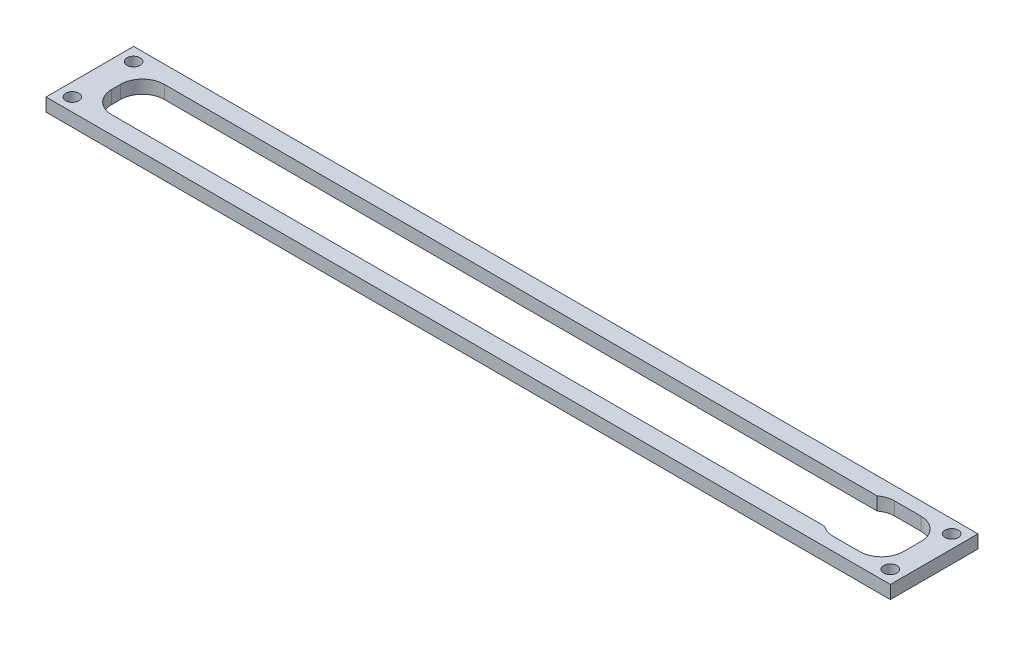
ISO-10303-21;
HEADER;
FILE_DESCRIPTION(('STEP AP214'),'2;1');
FILE_NAME('part.step','',(''),(''),'','','');
FILE_SCHEMA(('AUTOMOTIVE_DESIGN { 1 0 10303 214 1 1 1 1 }'));
ENDSEC;
DATA;
#1=APPLICATION_CONTEXT('core data for automotive mechanical design processes');
#2=APPLICATION_PROTOCOL_DEFINITION('international standard','automotive_design',2000,#1);
#3=PRODUCT_CONTEXT('',#1,'mechanical');
#4=PRODUCT('Part','Part','',(#3));
#5=PRODUCT_RELATED_PRODUCT_CATEGORY('part','',(#4));
#6=PRODUCT_DEFINITION_FORMATION('','',#4);
#7=PRODUCT_DEFINITION_CONTEXT('part definition',#1,'design');
#8=PRODUCT_DEFINITION('design','',#6,#7);
#9=PRODUCT_DEFINITION_SHAPE('','',#8);
#10=(LENGTH_UNIT() NAMED_UNIT(*) SI_UNIT(.MILLI.,.METRE.));
#11=(NAMED_UNIT(*) PLANE_ANGLE_UNIT() SI_UNIT($,.RADIAN.));
#12=(NAMED_UNIT(*) SI_UNIT($,.STERADIAN.) SOLID_ANGLE_UNIT());
#13=UNCERTAINTY_MEASURE_WITH_UNIT(LENGTH_MEASURE(1.E-05),#10,'distance_accuracy_value','');
#14=(GEOMETRIC_REPRESENTATION_CONTEXT(3) GLOBAL_UNCERTAINTY_ASSIGNED_CONTEXT((#13)) GLOBAL_UNIT_ASSIGNED_CONTEXT((#10,
#11,#12)) REPRESENTATION_CONTEXT('',''));
#15=CARTESIAN_POINT('',(0.,0.,0.));
#16=DIRECTION('',(0.,0.,1.));
#17=DIRECTION('',(1.,0.,0.));
#18=AXIS2_PLACEMENT_3D('',#15,#16,#17);
#19=CARTESIAN_POINT('',(0.,3.,0.));
#20=DIRECTION('',(0.,-1.,0.));
#21=DIRECTION('',(0.,0.,-1.));
#22=AXIS2_PLACEMENT_3D('',#19,#20,#21);
#23=PLANE('',#22);
#24=DIRECTION('',(0.,0.,1.));
#25=VECTOR('',#24,1.);
#26=CARTESIAN_POINT('',(0.,3.,0.));
#27=LINE('',#26,#25);
#28=CARTESIAN_POINT('',(0.,3.,-20.));
#29=VERTEX_POINT('',#28);
#30=CARTESIAN_POINT('',(0.,3.,0.));
#31=VERTEX_POINT('',#30);
#32=EDGE_CURVE('E250',#29,#31,#27,.T.);
#33=ORIENTED_EDGE('',*,*,#32,.T.);
#34=DIRECTION('',(1.,0.,0.));
#35=VECTOR('',#34,1.);
#36=CARTESIAN_POINT('',(0.,3.,0.));
#37=LINE('',#36,#35);
#38=CARTESIAN_POINT('',(192.641732707282,3.,0.));
#39=VERTEX_POINT('',#38);
#40=EDGE_CURVE('E253',#31,#39,#37,.T.);
#41=ORIENTED_EDGE('',*,*,#40,.T.);
#42=DIRECTION('',(0.,0.,-1.));
#43=VECTOR('',#42,1.);
#44=CARTESIAN_POINT('',(192.641732707282,3.,0.));
#45=LINE('',#44,#43);
#46=CARTESIAN_POINT('',(192.641732707282,3.,-20.));
#47=VERTEX_POINT('',#46);
#48=EDGE_CURVE('E256',#39,#47,#45,.T.);
#49=ORIENTED_EDGE('',*,*,#48,.T.);
#50=DIRECTION('',(-1.,0.,0.));
#51=VECTOR('',#50,1.);
#52=CARTESIAN_POINT('',(0.,3.,-20.));
#53=LINE('',#52,#51);
#54=EDGE_CURVE('E258',#47,#29,#53,.T.);
#55=ORIENTED_EDGE('',*,*,#54,.T.);
#56=EDGE_LOOP('',(#33,#41,#49,#55));
#57=FACE_BOUND('',#56,.T.);
#58=DIRECTION('',(-1.,0.,0.));
#59=VECTOR('',#58,1.);
#60=CARTESIAN_POINT('',(5.99999999999999,3.,-16.));
#61=LINE('',#60,#59);
#62=CARTESIAN_POINT('',(173.641732707282,3.,-16.));
#63=VERTEX_POINT('',#62);
#64=CARTESIAN_POINT('',(11.,3.,-16.));
#65=VERTEX_POINT('',#64);
#66=EDGE_CURVE('E243',#63,#65,#61,.T.);
#67=ORIENTED_EDGE('',*,*,#66,.F.);
#68=CARTESIAN_POINT('',(176.641732707282,3.,-12.));
#69=DIRECTION('',(0.,-1.,0.));
#70=DIRECTION('',(0.,0.,-1.));
#71=AXIS2_PLACEMENT_3D('',#68,#69,#70);
#72=CIRCLE('',#71,5.);
#73=CARTESIAN_POINT('',(176.641732707282,3.,-17.));
#74=VERTEX_POINT('',#73);
#75=EDGE_CURVE('E193',#63,#74,#72,.T.);
#76=ORIENTED_EDGE('',*,*,#75,.T.);
#77=DIRECTION('',(-1.,0.,0.));
#78=VECTOR('',#77,1.);
#79=CARTESIAN_POINT('',(173.641732707282,3.,-17.));
#80=LINE('',#79,#78);
#81=CARTESIAN_POINT('',(182.641732707282,3.,-17.));
#82=VERTEX_POINT('',#81);
#83=EDGE_CURVE('E205',#82,#74,#80,.T.);
#84=ORIENTED_EDGE('',*,*,#83,.F.);
#85=CARTESIAN_POINT('',(182.641732707282,3.,-12.));
#86=DIRECTION('',(0.,-1.,0.));
#87=DIRECTION('',(0.,0.,-1.));
#88=AXIS2_PLACEMENT_3D('',#85,#86,#87);
#89=CIRCLE('',#88,5.);
#90=CARTESIAN_POINT('',(187.641732707282,3.,-12.));
#91=VERTEX_POINT('',#90);
#92=EDGE_CURVE('E185',#82,#91,#89,.T.);
#93=ORIENTED_EDGE('',*,*,#92,.T.);
#94=DIRECTION('',(0.,0.,-1.));
#95=VECTOR('',#94,1.);
#96=CARTESIAN_POINT('',(187.641732707282,3.,-17.));
#97=LINE('',#96,#95);
#98=CARTESIAN_POINT('',(187.641732707282,3.,-8.00000000000001));
#99=VERTEX_POINT('',#98);
#100=EDGE_CURVE('E202',#99,#91,#97,.T.);
#101=ORIENTED_EDGE('',*,*,#100,.F.);
#102=CARTESIAN_POINT('',(182.641732707282,3.,-8.00000000000001));
#103=DIRECTION('',(0.,-1.,0.));
#104=DIRECTION('',(0.,0.,-1.));
#105=AXIS2_PLACEMENT_3D('',#102,#103,#104);
#106=CIRCLE('',#105,5.);
#107=CARTESIAN_POINT('',(182.641732707282,3.,-3.00000000000001));
#108=VERTEX_POINT('',#107);
#109=EDGE_CURVE('E189',#99,#108,#106,.T.);
#110=ORIENTED_EDGE('',*,*,#109,.T.);
#111=DIRECTION('',(1.,0.,0.));
#112=VECTOR('',#111,1.);
#113=CARTESIAN_POINT('',(173.641732707282,3.,-3.00000000000001));
#114=LINE('',#113,#112);
#115=CARTESIAN_POINT('',(176.641732707282,3.,-3.00000000000001));
#116=VERTEX_POINT('',#115);
#117=EDGE_CURVE('E200',#116,#108,#114,.T.);
#118=ORIENTED_EDGE('',*,*,#117,.F.);
#119=CARTESIAN_POINT('',(176.641732707282,3.,-8.00000000000001));
#120=DIRECTION('',(0.,-1.,0.));
#121=DIRECTION('',(0.,0.,-1.));
#122=AXIS2_PLACEMENT_3D('',#119,#120,#121);
#123=CIRCLE('',#122,5.);
#124=CARTESIAN_POINT('',(173.641732707282,3.,-4.00000000000002));
#125=VERTEX_POINT('',#124);
#126=EDGE_CURVE('E43',#116,#125,#123,.T.);
#127=ORIENTED_EDGE('',*,*,#126,.T.);
#128=DIRECTION('',(1.,0.,0.));
#129=VECTOR('',#128,1.);
#130=CARTESIAN_POINT('',(5.99999999999999,3.,-4.00000000000002));
#131=LINE('',#130,#129);
#132=CARTESIAN_POINT('',(11.,3.,-4.00000000000002));
#133=VERTEX_POINT('',#132);
#134=EDGE_CURVE('E162',#133,#125,#131,.T.);
#135=ORIENTED_EDGE('',*,*,#134,.F.);
#136=CARTESIAN_POINT('',(11.,3.,-9.00000000000001));
#137=DIRECTION('',(0.,-1.,0.));
#138=DIRECTION('',(0.,0.,-1.));
#139=AXIS2_PLACEMENT_3D('',#136,#137,#138);
#140=CIRCLE('',#139,5.);
#141=CARTESIAN_POINT('',(5.99999999999999,3.,-9.00000000000001));
#142=VERTEX_POINT('',#141);
#143=EDGE_CURVE('E179',#133,#142,#140,.T.);
#144=ORIENTED_EDGE('',*,*,#143,.T.);
#145=DIRECTION('',(0.,0.,1.));
#146=VECTOR('',#145,1.);
#147=CARTESIAN_POINT('',(5.99999999999999,3.,-16.));
#148=LINE('',#147,#146);
#149=CARTESIAN_POINT('',(5.99999999999999,3.,-11.));
#150=VERTEX_POINT('',#149);
#151=EDGE_CURVE('E239',#150,#142,#148,.T.);
#152=ORIENTED_EDGE('',*,*,#151,.F.);
#153=CARTESIAN_POINT('',(11.,3.,-11.));
#154=DIRECTION('',(0.,-1.,0.));
#155=DIRECTION('',(0.,0.,-1.));
#156=AXIS2_PLACEMENT_3D('',#153,#154,#155);
#157=CIRCLE('',#156,5.);
#158=EDGE_CURVE('E183',#150,#65,#157,.T.);
#159=ORIENTED_EDGE('',*,*,#158,.T.);
#160=EDGE_LOOP('',(#67,#76,#84,#93,#101,#110,#118,#127,#135,#144,#152,#159));
#161=FACE_BOUND('',#160,.T.);
#162=CARTESIAN_POINT('',(3.,3.,-17.));
#163=DIRECTION('',(0.,1.,0.));
#164=DIRECTION('',(0.,0.,1.));
#165=AXIS2_PLACEMENT_3D('',#162,#163,#164);
#166=CIRCLE('',#165,1.5);
#167=CARTESIAN_POINT('',(3.,3.,-15.5));
#168=VERTEX_POINT('',#167);
#169=EDGE_CURVE('E234',#168,#168,#166,.T.);
#170=ORIENTED_EDGE('',*,*,#169,.F.);
#171=EDGE_LOOP('',(#170));
#172=FACE_BOUND('',#171,.T.);
#173=CARTESIAN_POINT('',(3.,3.,-3.));
#174=DIRECTION('',(0.,1.,0.));
#175=DIRECTION('',(0.,0.,-1.));
#176=AXIS2_PLACEMENT_3D('',#173,#174,#175);
#177=CIRCLE('',#176,1.5);
#178=CARTESIAN_POINT('',(3.,3.,-4.5));
#179=VERTEX_POINT('',#178);
#180=EDGE_CURVE('E228',#179,#179,#177,.T.);
#181=ORIENTED_EDGE('',*,*,#180,.F.);
#182=EDGE_LOOP('',(#181));
#183=FACE_BOUND('',#182,.T.);
#184=CARTESIAN_POINT('',(189.641732707282,3.,-3.00000000000002));
#185=DIRECTION('',(0.,1.,0.));
#186=DIRECTION('',(0.,0.,1.));
#187=AXIS2_PLACEMENT_3D('',#184,#185,#186);
#188=CIRCLE('',#187,1.5);
#189=CARTESIAN_POINT('',(189.641732707282,3.,-1.50000000000002));
#190=VERTEX_POINT('',#189);
#191=EDGE_CURVE('E222',#190,#190,#188,.T.);
#192=ORIENTED_EDGE('',*,*,#191,.F.);
#193=EDGE_LOOP('',(#192));
#194=FACE_BOUND('',#193,.T.);
#195=CARTESIAN_POINT('',(189.641732707282,3.,-17.0000000000001));
#196=DIRECTION('',(0.,1.,0.));
#197=DIRECTION('',(0.,0.,-1.));
#198=AXIS2_PLACEMENT_3D('',#195,#196,#197);
#199=CIRCLE('',#198,1.5);
#200=CARTESIAN_POINT('',(189.641732707282,3.,-18.5000000000001));
#201=VERTEX_POINT('',#200);
#202=EDGE_CURVE('E216',#201,#201,#199,.T.);
#203=ORIENTED_EDGE('',*,*,#202,.F.);
#204=EDGE_LOOP('',(#203));
#205=FACE_BOUND('',#204,.T.);
#206=ADVANCED_FACE('F35',(#57,#161,#172,#183,#194,#205),#23,.F.);
#207=CARTESIAN_POINT('',(0.,0.,0.));
#208=DIRECTION('',(0.,-1.,0.));
#209=DIRECTION('',(0.,0.,-1.));
#210=AXIS2_PLACEMENT_3D('',#207,#208,#209);
#211=PLANE('',#210);
#212=DIRECTION('',(-1.,0.,0.));
#213=VECTOR('',#212,1.);
#214=CARTESIAN_POINT('',(173.641732707282,0.,-17.));
#215=LINE('',#214,#213);
#216=CARTESIAN_POINT('',(182.641732707282,0.,-17.));
#217=VERTEX_POINT('',#216);
#218=CARTESIAN_POINT('',(176.641732707282,0.,-17.));
#219=VERTEX_POINT('',#218);
#220=EDGE_CURVE('E165',#217,#219,#215,.T.);
#221=ORIENTED_EDGE('',*,*,#220,.T.);
#222=CARTESIAN_POINT('',(176.641732707282,0.,-12.));
#223=DIRECTION('',(0.,-1.,0.));
#224=DIRECTION('',(0.,0.,-1.));
#225=AXIS2_PLACEMENT_3D('',#222,#223,#224);
#226=CIRCLE('',#225,5.);
#227=CARTESIAN_POINT('',(173.641732707282,0.,-16.));
#228=VERTEX_POINT('',#227);
#229=EDGE_CURVE('E195',#219,#228,#226,.F.);
#230=ORIENTED_EDGE('',*,*,#229,.T.);
#231=DIRECTION('',(-1.,0.,0.));
#232=VECTOR('',#231,1.);
#233=CARTESIAN_POINT('',(5.99999999999999,0.,-16.));
#234=LINE('',#233,#232);
#235=CARTESIAN_POINT('',(11.,0.,-16.));
#236=VERTEX_POINT('',#235);
#237=EDGE_CURVE('E154',#228,#236,#234,.T.);
#238=ORIENTED_EDGE('',*,*,#237,.T.);
#239=CARTESIAN_POINT('',(11.,0.,-11.));
#240=DIRECTION('',(0.,-1.,0.));
#241=DIRECTION('',(0.,0.,-1.));
#242=AXIS2_PLACEMENT_3D('',#239,#240,#241);
#243=CIRCLE('',#242,5.);
#244=CARTESIAN_POINT('',(5.99999999999999,0.,-11.));
#245=VERTEX_POINT('',#244);
#246=EDGE_CURVE('E181',#236,#245,#243,.F.);
#247=ORIENTED_EDGE('',*,*,#246,.T.);
#248=DIRECTION('',(0.,0.,1.));
#249=VECTOR('',#248,1.);
#250=CARTESIAN_POINT('',(5.99999999999999,0.,-16.));
#251=LINE('',#250,#249);
#252=CARTESIAN_POINT('',(5.99999999999999,0.,-9.00000000000001));
#253=VERTEX_POINT('',#252);
#254=EDGE_CURVE('E155',#245,#253,#251,.T.);
#255=ORIENTED_EDGE('',*,*,#254,.T.);
#256=CARTESIAN_POINT('',(11.,0.,-9.00000000000001));
#257=DIRECTION('',(0.,-1.,0.));
#258=DIRECTION('',(0.,0.,-1.));
#259=AXIS2_PLACEMENT_3D('',#256,#257,#258);
#260=CIRCLE('',#259,5.);
#261=CARTESIAN_POINT('',(11.,0.,-4.00000000000002));
#262=VERTEX_POINT('',#261);
#263=EDGE_CURVE('E151',#253,#262,#260,.F.);
#264=ORIENTED_EDGE('',*,*,#263,.T.);
#265=DIRECTION('',(1.,0.,0.));
#266=VECTOR('',#265,1.);
#267=CARTESIAN_POINT('',(5.99999999999999,0.,-4.00000000000002));
#268=LINE('',#267,#266);
#269=CARTESIAN_POINT('',(173.641732707282,0.,-4.00000000000002));
#270=VERTEX_POINT('',#269);
#271=EDGE_CURVE('E145',#262,#270,#268,.T.);
#272=ORIENTED_EDGE('',*,*,#271,.T.);
#273=CARTESIAN_POINT('',(176.641732707282,0.,-8.00000000000001));
#274=DIRECTION('',(0.,-1.,0.));
#275=DIRECTION('',(0.,0.,-1.));
#276=AXIS2_PLACEMENT_3D('',#273,#274,#275);
#277=CIRCLE('',#276,5.);
#278=CARTESIAN_POINT('',(176.641732707282,0.,-3.00000000000001));
#279=VERTEX_POINT('',#278);
#280=EDGE_CURVE('E11',#270,#279,#277,.F.);
#281=ORIENTED_EDGE('',*,*,#280,.T.);
#282=DIRECTION('',(1.,0.,0.));
#283=VECTOR('',#282,1.);
#284=CARTESIAN_POINT('',(173.641732707282,0.,-3.00000000000001));
#285=LINE('',#284,#283);
#286=CARTESIAN_POINT('',(182.641732707282,0.,-3.00000000000001));
#287=VERTEX_POINT('',#286);
#288=EDGE_CURVE('E212',#279,#287,#285,.T.);
#289=ORIENTED_EDGE('',*,*,#288,.T.);
#290=CARTESIAN_POINT('',(182.641732707282,0.,-8.00000000000001));
#291=DIRECTION('',(0.,-1.,0.));
#292=DIRECTION('',(0.,0.,-1.));
#293=AXIS2_PLACEMENT_3D('',#290,#291,#292);
#294=CIRCLE('',#293,5.);
#295=CARTESIAN_POINT('',(187.641732707282,0.,-8.00000000000001));
#296=VERTEX_POINT('',#295);
#297=EDGE_CURVE('E191',#287,#296,#294,.F.);
#298=ORIENTED_EDGE('',*,*,#297,.T.);
#299=DIRECTION('',(0.,0.,-1.));
#300=VECTOR('',#299,1.);
#301=CARTESIAN_POINT('',(187.641732707282,0.,-17.));
#302=LINE('',#301,#300);
#303=CARTESIAN_POINT('',(187.641732707282,0.,-12.));
#304=VERTEX_POINT('',#303);
#305=EDGE_CURVE('E300',#296,#304,#302,.T.);
#306=ORIENTED_EDGE('',*,*,#305,.T.);
#307=CARTESIAN_POINT('',(182.641732707282,0.,-12.));
#308=DIRECTION('',(0.,-1.,0.));
#309=DIRECTION('',(0.,0.,-1.));
#310=AXIS2_PLACEMENT_3D('',#307,#308,#309);
#311=CIRCLE('',#310,5.);
#312=EDGE_CURVE('E187',#304,#217,#311,.F.);
#313=ORIENTED_EDGE('',*,*,#312,.T.);
#314=EDGE_LOOP('',(#221,#230,#238,#247,#255,#264,#272,#281,#289,#298,#306,#313));
#315=FACE_BOUND('',#314,.T.);
#316=CARTESIAN_POINT('',(189.641732707282,0.,-3.00000000000002));
#317=DIRECTION('',(0.,1.,0.));
#318=DIRECTION('',(0.,0.,1.));
#319=AXIS2_PLACEMENT_3D('',#316,#317,#318);
#320=CIRCLE('',#319,1.5);
#321=CARTESIAN_POINT('',(189.641732707282,0.,-1.50000000000002));
#322=VERTEX_POINT('',#321);
#323=EDGE_CURVE('E219',#322,#322,#320,.T.);
#324=ORIENTED_EDGE('',*,*,#323,.T.);
#325=EDGE_LOOP('',(#324));
#326=FACE_BOUND('',#325,.T.);
#327=CARTESIAN_POINT('',(3.,0.,-17.));
#328=DIRECTION('',(0.,1.,0.));
#329=DIRECTION('',(0.,0.,1.));
#330=AXIS2_PLACEMENT_3D('',#327,#328,#329);
#331=CIRCLE('',#330,1.5);
#332=CARTESIAN_POINT('',(3.,0.,-15.5));
#333=VERTEX_POINT('',#332);
#334=EDGE_CURVE('E231',#333,#333,#331,.T.);
#335=ORIENTED_EDGE('',*,*,#334,.T.);
#336=EDGE_LOOP('',(#335));
#337=FACE_BOUND('',#336,.T.);
#338=DIRECTION('',(0.,0.,1.));
#339=VECTOR('',#338,1.);
#340=CARTESIAN_POINT('',(0.,0.,0.));
#341=LINE('',#340,#339);
#342=CARTESIAN_POINT('',(0.,0.,-20.));
#343=VERTEX_POINT('',#342);
#344=CARTESIAN_POINT('',(0.,0.,0.));
#345=VERTEX_POINT('',#344);
#346=EDGE_CURVE('E246',#343,#345,#341,.T.);
#347=ORIENTED_EDGE('',*,*,#346,.F.);
#348=DIRECTION('',(-1.,0.,0.));
#349=VECTOR('',#348,1.);
#350=CARTESIAN_POINT('',(0.,0.,-20.));
#351=LINE('',#350,#349);
#352=CARTESIAN_POINT('',(192.641732707282,0.,-20.));
#353=VERTEX_POINT('',#352);
#354=EDGE_CURVE('E254',#353,#343,#351,.T.);
#355=ORIENTED_EDGE('',*,*,#354,.F.);
#356=DIRECTION('',(0.,0.,-1.));
#357=VECTOR('',#356,1.);
#358=CARTESIAN_POINT('',(192.641732707282,0.,0.));
#359=LINE('',#358,#357);
#360=CARTESIAN_POINT('',(192.641732707282,0.,0.));
#361=VERTEX_POINT('',#360);
#362=EDGE_CURVE('E265',#361,#353,#359,.T.);
#363=ORIENTED_EDGE('',*,*,#362,.F.);
#364=DIRECTION('',(1.,0.,0.));
#365=VECTOR('',#364,1.);
#366=CARTESIAN_POINT('',(0.,0.,0.));
#367=LINE('',#366,#365);
#368=EDGE_CURVE('E263',#345,#361,#367,.T.);
#369=ORIENTED_EDGE('',*,*,#368,.F.);
#370=EDGE_LOOP('',(#347,#355,#363,#369));
#371=FACE_BOUND('',#370,.T.);
#372=CARTESIAN_POINT('',(3.,0.,-3.));
#373=DIRECTION('',(0.,1.,0.));
#374=DIRECTION('',(0.,0.,-1.));
#375=AXIS2_PLACEMENT_3D('',#372,#373,#374);
#376=CIRCLE('',#375,1.5);
#377=CARTESIAN_POINT('',(3.,0.,-4.5));
#378=VERTEX_POINT('',#377);
#379=EDGE_CURVE('E225',#378,#378,#376,.T.);
#380=ORIENTED_EDGE('',*,*,#379,.T.);
#381=EDGE_LOOP('',(#380));
#382=FACE_BOUND('',#381,.T.);
#383=CARTESIAN_POINT('',(189.641732707282,0.,-17.0000000000001));
#384=DIRECTION('',(0.,1.,0.));
#385=DIRECTION('',(0.,0.,-1.));
#386=AXIS2_PLACEMENT_3D('',#383,#384,#385);
#387=CIRCLE('',#386,1.5);
#388=CARTESIAN_POINT('',(189.641732707282,0.,-18.5000000000001));
#389=VERTEX_POINT('',#388);
#390=EDGE_CURVE('E214',#389,#389,#387,.T.);
#391=ORIENTED_EDGE('',*,*,#390,.T.);
#392=EDGE_LOOP('',(#391));
#393=FACE_BOUND('',#392,.T.);
#394=ADVANCED_FACE('F148',(#315,#326,#337,#371,#382,#393),#211,.T.);
#395=CARTESIAN_POINT('',(0.,3.,0.));
#396=DIRECTION('',(1.,0.,0.));
#397=DIRECTION('',(0.,0.,-1.));
#398=AXIS2_PLACEMENT_3D('',#395,#396,#397);
#399=PLANE('',#398);
#400=ORIENTED_EDGE('',*,*,#346,.T.);
#401=DIRECTION('',(0.,-1.,0.));
#402=VECTOR('',#401,1.);
#403=CARTESIAN_POINT('',(0.,3.,0.));
#404=LINE('',#403,#402);
#405=EDGE_CURVE('E276',#31,#345,#404,.T.);
#406=ORIENTED_EDGE('',*,*,#405,.F.);
#407=ORIENTED_EDGE('',*,*,#32,.F.);
#408=DIRECTION('',(0.,-1.,0.));
#409=VECTOR('',#408,1.);
#410=CARTESIAN_POINT('',(0.,3.,-20.));
#411=LINE('',#410,#409);
#412=EDGE_CURVE('E260',#29,#343,#411,.T.);
#413=ORIENTED_EDGE('',*,*,#412,.T.);
#414=EDGE_LOOP('',(#400,#406,#407,#413));
#415=FACE_BOUND('',#414,.T.);
#416=ADVANCED_FACE('F331',(#415),#399,.F.);
#417=CARTESIAN_POINT('',(0.,3.,0.));
#418=DIRECTION('',(0.,0.,-1.));
#419=DIRECTION('',(-1.,0.,0.));
#420=AXIS2_PLACEMENT_3D('',#417,#418,#419);
#421=PLANE('',#420);
#422=ORIENTED_EDGE('',*,*,#368,.T.);
#423=DIRECTION('',(0.,-1.,0.));
#424=VECTOR('',#423,1.);
#425=CARTESIAN_POINT('',(192.641732707282,3.,0.));
#426=LINE('',#425,#424);
#427=EDGE_CURVE('E273',#39,#361,#426,.T.);
#428=ORIENTED_EDGE('',*,*,#427,.F.);
#429=ORIENTED_EDGE('',*,*,#40,.F.);
#430=ORIENTED_EDGE('',*,*,#405,.T.);
#431=EDGE_LOOP('',(#422,#428,#429,#430));
#432=FACE_BOUND('',#431,.T.);
#433=ADVANCED_FACE('F344',(#432),#421,.F.);
#434=CARTESIAN_POINT('',(192.641732707282,3.,0.));
#435=DIRECTION('',(-1.,0.,0.));
#436=DIRECTION('',(0.,0.,1.));
#437=AXIS2_PLACEMENT_3D('',#434,#435,#436);
#438=PLANE('',#437);
#439=ORIENTED_EDGE('',*,*,#362,.T.);
#440=DIRECTION('',(0.,-1.,0.));
#441=VECTOR('',#440,1.);
#442=CARTESIAN_POINT('',(192.641732707282,3.,-20.));
#443=LINE('',#442,#441);
#444=EDGE_CURVE('E270',#47,#353,#443,.T.);
#445=ORIENTED_EDGE('',*,*,#444,.F.);
#446=ORIENTED_EDGE('',*,*,#48,.F.);
#447=ORIENTED_EDGE('',*,*,#427,.T.);
#448=EDGE_LOOP('',(#439,#445,#446,#447));
#449=FACE_BOUND('',#448,.T.);
#450=ADVANCED_FACE('F340',(#449),#438,.F.);
#451=CARTESIAN_POINT('',(0.,3.,-20.));
#452=DIRECTION('',(0.,0.,1.));
#453=DIRECTION('',(1.,0.,0.));
#454=AXIS2_PLACEMENT_3D('',#451,#452,#453);
#455=PLANE('',#454);
#456=ORIENTED_EDGE('',*,*,#354,.T.);
#457=ORIENTED_EDGE('',*,*,#412,.F.);
#458=ORIENTED_EDGE('',*,*,#54,.F.);
#459=ORIENTED_EDGE('',*,*,#444,.T.);
#460=EDGE_LOOP('',(#456,#457,#458,#459));
#461=FACE_BOUND('',#460,.T.);
#462=ADVANCED_FACE('F337',(#461),#455,.F.);
#463=CARTESIAN_POINT('',(5.99999999999999,3.,-16.));
#464=DIRECTION('',(1.,0.,0.));
#465=DIRECTION('',(0.,0.,-1.));
#466=AXIS2_PLACEMENT_3D('',#463,#464,#465);
#467=PLANE('',#466);
#468=ORIENTED_EDGE('',*,*,#151,.T.);
#469=DIRECTION('',(0.,-1.,0.));
#470=VECTOR('',#469,1.);
#471=CARTESIAN_POINT('',(5.99999999999999,0.,-9.00000000000001));
#472=LINE('',#471,#470);
#473=EDGE_CURVE('E281',#142,#253,#472,.T.);
#474=ORIENTED_EDGE('',*,*,#473,.T.);
#475=ORIENTED_EDGE('',*,*,#254,.F.);
#476=DIRECTION('',(0.,-1.,0.));
#477=VECTOR('',#476,1.);
#478=CARTESIAN_POINT('',(5.99999999999999,3.,-11.));
#479=LINE('',#478,#477);
#480=EDGE_CURVE('E279',#245,#150,#479,.F.);
#481=ORIENTED_EDGE('',*,*,#480,.T.);
#482=EDGE_LOOP('',(#468,#474,#475,#481));
#483=FACE_BOUND('',#482,.T.);
#484=ADVANCED_FACE('F334',(#483),#467,.T.);
#485=CARTESIAN_POINT('',(5.99999999999999,3.,-4.00000000000002));
#486=DIRECTION('',(0.,0.,-1.));
#487=DIRECTION('',(-1.,0.,0.));
#488=AXIS2_PLACEMENT_3D('',#485,#486,#487);
#489=PLANE('',#488);
#490=ORIENTED_EDGE('',*,*,#271,.F.);
#491=DIRECTION('',(0.,-1.,0.));
#492=VECTOR('',#491,1.);
#493=CARTESIAN_POINT('',(11.,3.,-4.00000000000002));
#494=LINE('',#493,#492);
#495=EDGE_CURVE('E284',#262,#133,#494,.F.);
#496=ORIENTED_EDGE('',*,*,#495,.T.);
#497=ORIENTED_EDGE('',*,*,#134,.T.);
#498=DIRECTION('',(0.,1.,0.));
#499=VECTOR('',#498,1.);
#500=CARTESIAN_POINT('',(173.641732707282,0.,-4.00000000000002));
#501=LINE('',#500,#499);
#502=EDGE_CURVE('E159',#270,#125,#501,.T.);
#503=ORIENTED_EDGE('',*,*,#502,.F.);
#504=EDGE_LOOP('',(#490,#496,#497,#503));
#505=FACE_BOUND('',#504,.T.);
#506=ADVANCED_FACE('F160',(#505),#489,.T.);
#507=CARTESIAN_POINT('',(5.99999999999999,3.,-16.));
#508=DIRECTION('',(0.,0.,1.));
#509=DIRECTION('',(1.,0.,0.));
#510=AXIS2_PLACEMENT_3D('',#507,#508,#509);
#511=PLANE('',#510);
#512=ORIENTED_EDGE('',*,*,#66,.T.);
#513=DIRECTION('',(0.,-1.,0.));
#514=VECTOR('',#513,1.);
#515=CARTESIAN_POINT('',(11.,0.,-16.));
#516=LINE('',#515,#514);
#517=EDGE_CURVE('E286',#65,#236,#516,.T.);
#518=ORIENTED_EDGE('',*,*,#517,.T.);
#519=ORIENTED_EDGE('',*,*,#237,.F.);
#520=DIRECTION('',(0.,1.,0.));
#521=VECTOR('',#520,1.);
#522=CARTESIAN_POINT('',(173.641732707282,0.,-16.));
#523=LINE('',#522,#521);
#524=EDGE_CURVE('E164',#228,#63,#523,.T.);
#525=ORIENTED_EDGE('',*,*,#524,.T.);
#526=EDGE_LOOP('',(#512,#518,#519,#525));
#527=FACE_BOUND('',#526,.T.);
#528=ADVANCED_FACE('F366',(#527),#511,.T.);
#529=CARTESIAN_POINT('',(3.,3.,-17.));
#530=DIRECTION('',(0.,-1.,0.));
#531=DIRECTION('',(0.,0.,-1.));
#532=AXIS2_PLACEMENT_3D('',#529,#530,#531);
#533=CYLINDRICAL_SURFACE('',#532,1.5);
#534=ORIENTED_EDGE('',*,*,#169,.T.);
#535=EDGE_LOOP('',(#534));
#536=FACE_BOUND('',#535,.T.);
#537=ORIENTED_EDGE('',*,*,#334,.F.);
#538=EDGE_LOOP('',(#537));
#539=FACE_BOUND('',#538,.T.);
#540=ADVANCED_FACE('F379',(#536,#539),#533,.F.);
#541=CARTESIAN_POINT('',(3.,3.,-3.));
#542=DIRECTION('',(0.,-1.,0.));
#543=DIRECTION('',(0.,0.,-1.));
#544=AXIS2_PLACEMENT_3D('',#541,#542,#543);
#545=CYLINDRICAL_SURFACE('',#544,1.5);
#546=ORIENTED_EDGE('',*,*,#180,.T.);
#547=EDGE_LOOP('',(#546));
#548=FACE_BOUND('',#547,.T.);
#549=ORIENTED_EDGE('',*,*,#379,.F.);
#550=EDGE_LOOP('',(#549));
#551=FACE_BOUND('',#550,.T.);
#552=ADVANCED_FACE('F384',(#548,#551),#545,.F.);
#553=CARTESIAN_POINT('',(189.641732707282,3.,-3.00000000000002));
#554=DIRECTION('',(0.,-1.,0.));
#555=DIRECTION('',(0.,0.,-1.));
#556=AXIS2_PLACEMENT_3D('',#553,#554,#555);
#557=CYLINDRICAL_SURFACE('',#556,1.5);
#558=ORIENTED_EDGE('',*,*,#191,.T.);
#559=EDGE_LOOP('',(#558));
#560=FACE_BOUND('',#559,.T.);
#561=ORIENTED_EDGE('',*,*,#323,.F.);
#562=EDGE_LOOP('',(#561));
#563=FACE_BOUND('',#562,.T.);
#564=ADVANCED_FACE('F388',(#560,#563),#557,.F.);
#565=CARTESIAN_POINT('',(189.641732707282,3.,-17.0000000000001));
#566=DIRECTION('',(0.,-1.,0.));
#567=DIRECTION('',(0.,0.,-1.));
#568=AXIS2_PLACEMENT_3D('',#565,#566,#567);
#569=CYLINDRICAL_SURFACE('',#568,1.5);
#570=ORIENTED_EDGE('',*,*,#202,.T.);
#571=EDGE_LOOP('',(#570));
#572=FACE_BOUND('',#571,.T.);
#573=ORIENTED_EDGE('',*,*,#390,.F.);
#574=EDGE_LOOP('',(#573));
#575=FACE_BOUND('',#574,.T.);
#576=ADVANCED_FACE('F392',(#572,#575),#569,.F.);
#577=CARTESIAN_POINT('',(173.641732707282,0.,-17.));
#578=DIRECTION('',(0.,0.,-1.));
#579=DIRECTION('',(-1.,0.,0.));
#580=AXIS2_PLACEMENT_3D('',#577,#578,#579);
#581=PLANE('',#580);
#582=ORIENTED_EDGE('',*,*,#220,.F.);
#583=DIRECTION('',(0.,1.,0.));
#584=VECTOR('',#583,1.);
#585=CARTESIAN_POINT('',(182.641732707282,3.,-17.));
#586=LINE('',#585,#584);
#587=EDGE_CURVE('E291',#217,#82,#586,.T.);
#588=ORIENTED_EDGE('',*,*,#587,.T.);
#589=ORIENTED_EDGE('',*,*,#83,.T.);
#590=DIRECTION('',(0.,1.,0.));
#591=VECTOR('',#590,1.);
#592=CARTESIAN_POINT('',(176.641732707282,0.,-17.));
#593=LINE('',#592,#591);
#594=EDGE_CURVE('E289',#74,#219,#593,.F.);
#595=ORIENTED_EDGE('',*,*,#594,.T.);
#596=EDGE_LOOP('',(#582,#588,#589,#595));
#597=FACE_BOUND('',#596,.T.);
#598=ADVANCED_FACE('F310',(#597),#581,.F.);
#599=CARTESIAN_POINT('',(187.641732707282,0.,-17.));
#600=DIRECTION('',(1.,0.,0.));
#601=DIRECTION('',(0.,0.,-1.));
#602=AXIS2_PLACEMENT_3D('',#599,#600,#601);
#603=PLANE('',#602);
#604=ORIENTED_EDGE('',*,*,#100,.T.);
#605=DIRECTION('',(0.,1.,0.));
#606=VECTOR('',#605,1.);
#607=CARTESIAN_POINT('',(187.641732707282,0.,-12.));
#608=LINE('',#607,#606);
#609=EDGE_CURVE('E171',#91,#304,#608,.F.);
#610=ORIENTED_EDGE('',*,*,#609,.T.);
#611=ORIENTED_EDGE('',*,*,#305,.F.);
#612=DIRECTION('',(0.,1.,0.));
#613=VECTOR('',#612,1.);
#614=CARTESIAN_POINT('',(187.641732707282,3.,-8.00000000000001));
#615=LINE('',#614,#613);
#616=EDGE_CURVE('E174',#296,#99,#615,.T.);
#617=ORIENTED_EDGE('',*,*,#616,.T.);
#618=EDGE_LOOP('',(#604,#610,#611,#617));
#619=FACE_BOUND('',#618,.T.);
#620=ADVANCED_FACE('F297',(#619),#603,.F.);
#621=CARTESIAN_POINT('',(173.641732707282,0.,-3.00000000000001));
#622=DIRECTION('',(0.,0.,1.));
#623=DIRECTION('',(1.,0.,0.));
#624=AXIS2_PLACEMENT_3D('',#621,#622,#623);
#625=PLANE('',#624);
#626=ORIENTED_EDGE('',*,*,#117,.T.);
#627=DIRECTION('',(0.,1.,0.));
#628=VECTOR('',#627,1.);
#629=CARTESIAN_POINT('',(182.641732707282,0.,-3.00000000000001));
#630=LINE('',#629,#628);
#631=EDGE_CURVE('E50',#108,#287,#630,.F.);
#632=ORIENTED_EDGE('',*,*,#631,.T.);
#633=ORIENTED_EDGE('',*,*,#288,.F.);
#634=DIRECTION('',(0.,-1.,0.));
#635=VECTOR('',#634,1.);
#636=CARTESIAN_POINT('',(176.641732707282,0.,-3.00000000000001));
#637=LINE('',#636,#635);
#638=EDGE_CURVE('E169',#279,#116,#637,.F.);
#639=ORIENTED_EDGE('',*,*,#638,.T.);
#640=EDGE_LOOP('',(#626,#632,#633,#639));
#641=FACE_BOUND('',#640,.T.);
#642=ADVANCED_FACE('F355',(#641),#625,.F.);
#643=CARTESIAN_POINT('',(11.,3.,-9.00000000000001));
#644=DIRECTION('',(0.,1.,0.));
#645=DIRECTION('',(0.,0.,1.));
#646=AXIS2_PLACEMENT_3D('',#643,#644,#645);
#647=CYLINDRICAL_SURFACE('',#646,5.);
#648=ORIENTED_EDGE('',*,*,#143,.F.);
#649=ORIENTED_EDGE('',*,*,#495,.F.);
#650=ORIENTED_EDGE('',*,*,#263,.F.);
#651=ORIENTED_EDGE('',*,*,#473,.F.);
#652=EDGE_LOOP('',(#648,#649,#650,#651));
#653=FACE_BOUND('',#652,.T.);
#654=ADVANCED_FACE('F352',(#653),#647,.F.);
#655=CARTESIAN_POINT('',(11.,3.,-11.));
#656=DIRECTION('',(0.,1.,0.));
#657=DIRECTION('',(0.,0.,1.));
#658=AXIS2_PLACEMENT_3D('',#655,#656,#657);
#659=CYLINDRICAL_SURFACE('',#658,5.);
#660=ORIENTED_EDGE('',*,*,#158,.F.);
#661=ORIENTED_EDGE('',*,*,#480,.F.);
#662=ORIENTED_EDGE('',*,*,#246,.F.);
#663=ORIENTED_EDGE('',*,*,#517,.F.);
#664=EDGE_LOOP('',(#660,#661,#662,#663));
#665=FACE_BOUND('',#664,.T.);
#666=ADVANCED_FACE('F323',(#665),#659,.F.);
#667=CARTESIAN_POINT('',(182.641732707282,0.,-12.));
#668=DIRECTION('',(0.,-1.,0.));
#669=DIRECTION('',(0.,0.,-1.));
#670=AXIS2_PLACEMENT_3D('',#667,#668,#669);
#671=CYLINDRICAL_SURFACE('',#670,5.);
#672=ORIENTED_EDGE('',*,*,#312,.F.);
#673=ORIENTED_EDGE('',*,*,#609,.F.);
#674=ORIENTED_EDGE('',*,*,#92,.F.);
#675=ORIENTED_EDGE('',*,*,#587,.F.);
#676=EDGE_LOOP('',(#672,#673,#674,#675));
#677=FACE_BOUND('',#676,.T.);
#678=ADVANCED_FACE('F307',(#677),#671,.F.);
#679=CARTESIAN_POINT('',(182.641732707282,0.,-8.00000000000001));
#680=DIRECTION('',(0.,-1.,0.));
#681=DIRECTION('',(0.,0.,-1.));
#682=AXIS2_PLACEMENT_3D('',#679,#680,#681);
#683=CYLINDRICAL_SURFACE('',#682,5.);
#684=ORIENTED_EDGE('',*,*,#297,.F.);
#685=ORIENTED_EDGE('',*,*,#631,.F.);
#686=ORIENTED_EDGE('',*,*,#109,.F.);
#687=ORIENTED_EDGE('',*,*,#616,.F.);
#688=EDGE_LOOP('',(#684,#685,#686,#687));
#689=FACE_BOUND('',#688,.T.);
#690=ADVANCED_FACE('F314',(#689),#683,.F.);
#691=CARTESIAN_POINT('',(176.641732707282,0.,-12.));
#692=DIRECTION('',(0.,1.,0.));
#693=DIRECTION('',(0.,0.,1.));
#694=AXIS2_PLACEMENT_3D('',#691,#692,#693);
#695=CYLINDRICAL_SURFACE('',#694,5.);
#696=ORIENTED_EDGE('',*,*,#229,.F.);
#697=ORIENTED_EDGE('',*,*,#594,.F.);
#698=ORIENTED_EDGE('',*,*,#75,.F.);
#699=ORIENTED_EDGE('',*,*,#524,.F.);
#700=EDGE_LOOP('',(#696,#697,#698,#699));
#701=FACE_BOUND('',#700,.T.);
#702=ADVANCED_FACE('F316',(#701),#695,.F.);
#703=CARTESIAN_POINT('',(176.641732707282,0.,-8.00000000000001));
#704=DIRECTION('',(0.,-1.,0.));
#705=DIRECTION('',(0.,0.,-1.));
#706=AXIS2_PLACEMENT_3D('',#703,#704,#705);
#707=CYLINDRICAL_SURFACE('',#706,5.);
#708=ORIENTED_EDGE('',*,*,#280,.F.);
#709=ORIENTED_EDGE('',*,*,#502,.T.);
#710=ORIENTED_EDGE('',*,*,#126,.F.);
#711=ORIENTED_EDGE('',*,*,#638,.F.);
#712=EDGE_LOOP('',(#708,#709,#710,#711));
#713=FACE_BOUND('',#712,.T.);
#714=ADVANCED_FACE('F37',(#713),#707,.F.);
#715=CLOSED_SHELL('',(#206,#394,#416,#433,#450,#462,#484,#506,#528,#540,#552,#564,#576,#598,
#620,#642,#654,#666,#678,#690,#702,#714));
#716=MANIFOLD_SOLID_BREP('B2',#715);
#717=ADVANCED_BREP_SHAPE_REPRESENTATION('',(#18,#716),#14);
#718=SHAPE_DEFINITION_REPRESENTATION(#9,#717);
ENDSEC;
END-ISO-10303-21;
